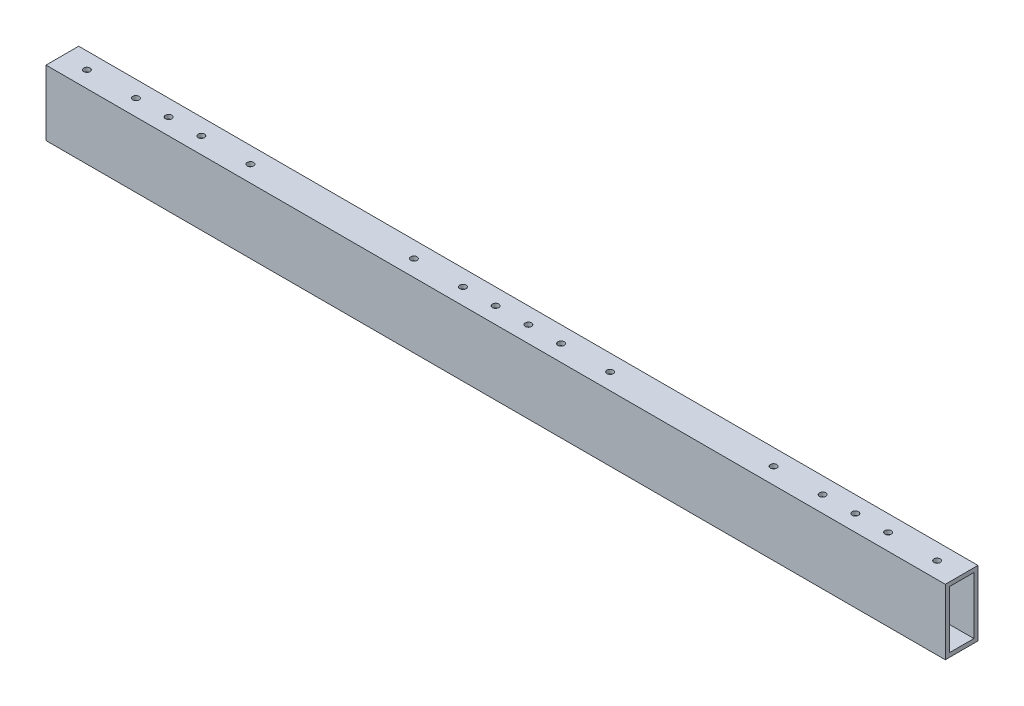
ISO-10303-21;
HEADER;
FILE_DESCRIPTION(('STEP AP214'),'2;1');
FILE_NAME('part.step','',(''),(''),'','','');
FILE_SCHEMA(('AUTOMOTIVE_DESIGN { 1 0 10303 214 1 1 1 1 }'));
ENDSEC;
DATA;
#1=APPLICATION_CONTEXT('core data for automotive mechanical design processes');
#2=APPLICATION_PROTOCOL_DEFINITION('international standard','automotive_design',2000,#1);
#3=PRODUCT_CONTEXT('',#1,'mechanical');
#4=PRODUCT('Part','Part','',(#3));
#5=PRODUCT_RELATED_PRODUCT_CATEGORY('part','',(#4));
#6=PRODUCT_DEFINITION_FORMATION('','',#4);
#7=PRODUCT_DEFINITION_CONTEXT('part definition',#1,'design');
#8=PRODUCT_DEFINITION('design','',#6,#7);
#9=PRODUCT_DEFINITION_SHAPE('','',#8);
#10=(LENGTH_UNIT() NAMED_UNIT(*) SI_UNIT(.MILLI.,.METRE.));
#11=(NAMED_UNIT(*) PLANE_ANGLE_UNIT() SI_UNIT($,.RADIAN.));
#12=(NAMED_UNIT(*) SI_UNIT($,.STERADIAN.) SOLID_ANGLE_UNIT());
#13=UNCERTAINTY_MEASURE_WITH_UNIT(LENGTH_MEASURE(1.E-05),#10,'distance_accuracy_value','');
#14=(GEOMETRIC_REPRESENTATION_CONTEXT(3) GLOBAL_UNCERTAINTY_ASSIGNED_CONTEXT((#13)) GLOBAL_UNIT_ASSIGNED_CONTEXT((#10,
#11,#12)) REPRESENTATION_CONTEXT('',''));
#15=CARTESIAN_POINT('',(0.,0.,0.));
#16=DIRECTION('',(0.,0.,1.));
#17=DIRECTION('',(1.,0.,0.));
#18=AXIS2_PLACEMENT_3D('',#15,#16,#17);
#19=CARTESIAN_POINT('',(-349.25,-3.175,-3.175));
#20=DIRECTION('',(0.,-1.,0.));
#21=DIRECTION('',(0.,0.,-1.));
#22=AXIS2_PLACEMENT_3D('',#19,#20,#21);
#23=PLANE('',#22);
#24=CARTESIAN_POINT('',(190.5,-3.175,9.525));
#25=DIRECTION('',(0.,-1.,0.));
#26=DIRECTION('',(0.,0.,-1.));
#27=AXIS2_PLACEMENT_3D('',#24,#25,#26);
#28=CIRCLE('',#27,2.4638);
#29=CARTESIAN_POINT('',(190.5,-3.175,7.0612));
#30=VERTEX_POINT('',#29);
#31=EDGE_CURVE('E195',#30,#30,#28,.T.);
#32=ORIENTED_EDGE('',*,*,#31,.F.);
#33=EDGE_LOOP('',(#32));
#34=FACE_BOUND('',#33,.T.);
#35=CARTESIAN_POINT('',(114.3,-3.175,9.525));
#36=DIRECTION('',(0.,-1.,0.));
#37=DIRECTION('',(0.,0.,-1.));
#38=AXIS2_PLACEMENT_3D('',#35,#36,#37);
#39=CIRCLE('',#38,2.4638);
#40=CARTESIAN_POINT('',(114.3,-3.175,7.0612));
#41=VERTEX_POINT('',#40);
#42=EDGE_CURVE('E199',#41,#41,#39,.T.);
#43=ORIENTED_EDGE('',*,*,#42,.F.);
#44=EDGE_LOOP('',(#43));
#45=FACE_BOUND('',#44,.T.);
#46=CARTESIAN_POINT('',(38.0999999999999,-3.175,9.525));
#47=DIRECTION('',(0.,-1.,0.));
#48=DIRECTION('',(0.,0.,-1.));
#49=AXIS2_PLACEMENT_3D('',#46,#47,#48);
#50=CIRCLE('',#49,2.4638);
#51=CARTESIAN_POINT('',(38.0999999999999,-3.175,7.0612));
#52=VERTEX_POINT('',#51);
#53=EDGE_CURVE('E203',#52,#52,#50,.T.);
#54=ORIENTED_EDGE('',*,*,#53,.F.);
#55=EDGE_LOOP('',(#54));
#56=FACE_BOUND('',#55,.T.);
#57=CARTESIAN_POINT('',(-38.1,-3.175,9.525));
#58=DIRECTION('',(0.,-1.,0.));
#59=DIRECTION('',(0.,0.,-1.));
#60=AXIS2_PLACEMENT_3D('',#57,#58,#59);
#61=CIRCLE('',#60,2.4638);
#62=CARTESIAN_POINT('',(-38.1,-3.175,7.0612));
#63=VERTEX_POINT('',#62);
#64=EDGE_CURVE('E207',#63,#63,#61,.T.);
#65=ORIENTED_EDGE('',*,*,#64,.F.);
#66=EDGE_LOOP('',(#65));
#67=FACE_BOUND('',#66,.T.);
#68=CARTESIAN_POINT('',(-114.3,-3.175,9.525));
#69=DIRECTION('',(0.,-1.,0.));
#70=DIRECTION('',(0.,0.,-1.));
#71=AXIS2_PLACEMENT_3D('',#68,#69,#70);
#72=CIRCLE('',#71,2.4638);
#73=CARTESIAN_POINT('',(-114.3,-3.175,7.0612));
#74=VERTEX_POINT('',#73);
#75=EDGE_CURVE('E211',#74,#74,#72,.T.);
#76=ORIENTED_EDGE('',*,*,#75,.F.);
#77=EDGE_LOOP('',(#76));
#78=FACE_BOUND('',#77,.T.);
#79=CARTESIAN_POINT('',(-190.5,-3.175,9.525));
#80=DIRECTION('',(0.,-1.,0.));
#81=DIRECTION('',(0.,0.,-1.));
#82=AXIS2_PLACEMENT_3D('',#79,#80,#81);
#83=CIRCLE('',#82,2.4638);
#84=CARTESIAN_POINT('',(-190.5,-3.175,7.0612));
#85=VERTEX_POINT('',#84);
#86=EDGE_CURVE('E215',#85,#85,#83,.T.);
#87=ORIENTED_EDGE('',*,*,#86,.F.);
#88=EDGE_LOOP('',(#87));
#89=FACE_BOUND('',#88,.T.);
#90=CARTESIAN_POINT('',(-266.7,-3.175,9.525));
#91=DIRECTION('',(0.,-1.,0.));
#92=DIRECTION('',(0.,0.,-1.));
#93=AXIS2_PLACEMENT_3D('',#90,#91,#92);
#94=CIRCLE('',#93,2.4638);
#95=CARTESIAN_POINT('',(-266.7,-3.175,7.0612));
#96=VERTEX_POINT('',#95);
#97=EDGE_CURVE('E219',#96,#96,#94,.T.);
#98=ORIENTED_EDGE('',*,*,#97,.F.);
#99=EDGE_LOOP('',(#98));
#100=FACE_BOUND('',#99,.T.);
#101=CARTESIAN_POINT('',(266.7,-3.175,9.525));
#102=DIRECTION('',(0.,-1.,0.));
#103=DIRECTION('',(0.,0.,-1.));
#104=AXIS2_PLACEMENT_3D('',#101,#102,#103);
#105=CIRCLE('',#104,2.4638);
#106=CARTESIAN_POINT('',(266.7,-3.175,7.0612));
#107=VERTEX_POINT('',#106);
#108=EDGE_CURVE('E222',#107,#107,#105,.T.);
#109=ORIENTED_EDGE('',*,*,#108,.F.);
#110=EDGE_LOOP('',(#109));
#111=FACE_BOUND('',#110,.T.);
#112=DIRECTION('',(1.,0.,0.));
#113=VECTOR('',#112,1.);
#114=CARTESIAN_POINT('',(-349.25,-3.175,-3.175));
#115=LINE('',#114,#113);
#116=CARTESIAN_POINT('',(-349.25,-3.175,-3.175));
#117=VERTEX_POINT('',#116);
#118=CARTESIAN_POINT('',(349.25,-3.175,-3.175));
#119=VERTEX_POINT('',#118);
#120=EDGE_CURVE('E35',#117,#119,#115,.T.);
#121=ORIENTED_EDGE('',*,*,#120,.T.);
#122=DIRECTION('',(0.,0.,-1.));
#123=VECTOR('',#122,1.);
#124=CARTESIAN_POINT('',(349.25,-3.175,-3.175));
#125=LINE('',#124,#123);
#126=CARTESIAN_POINT('',(349.25,-3.175,22.225));
#127=VERTEX_POINT('',#126);
#128=EDGE_CURVE('E129',#127,#119,#125,.T.);
#129=ORIENTED_EDGE('',*,*,#128,.F.);
#130=DIRECTION('',(1.,0.,0.));
#131=VECTOR('',#130,1.);
#132=CARTESIAN_POINT('',(-349.25,-3.175,22.225));
#133=LINE('',#132,#131);
#134=CARTESIAN_POINT('',(-349.25,-3.175,22.225));
#135=VERTEX_POINT('',#134);
#136=EDGE_CURVE('E11',#135,#127,#133,.T.);
#137=ORIENTED_EDGE('',*,*,#136,.F.);
#138=DIRECTION('',(0.,0.,-1.));
#139=VECTOR('',#138,1.);
#140=CARTESIAN_POINT('',(-349.25,-3.175,-3.175));
#141=LINE('',#140,#139);
#142=EDGE_CURVE('E148',#135,#117,#141,.T.);
#143=ORIENTED_EDGE('',*,*,#142,.T.);
#144=EDGE_LOOP('',(#121,#129,#137,#143));
#145=FACE_BOUND('',#144,.T.);
#146=ADVANCED_FACE('F32',(#34,#45,#56,#67,#78,#89,#100,#111,#145),#23,.T.);
#147=CARTESIAN_POINT('',(-349.25,-3.175,22.225));
#148=DIRECTION('',(0.,0.,1.));
#149=DIRECTION('',(1.,0.,0.));
#150=AXIS2_PLACEMENT_3D('',#147,#148,#149);
#151=PLANE('',#150);
#152=ORIENTED_EDGE('',*,*,#136,.T.);
#153=DIRECTION('',(0.,-1.,0.));
#154=VECTOR('',#153,1.);
#155=CARTESIAN_POINT('',(349.25,-3.175,22.225));
#156=LINE('',#155,#154);
#157=CARTESIAN_POINT('',(349.25,47.625,22.225));
#158=VERTEX_POINT('',#157);
#159=EDGE_CURVE('E138',#158,#127,#156,.T.);
#160=ORIENTED_EDGE('',*,*,#159,.F.);
#161=DIRECTION('',(1.,0.,0.));
#162=VECTOR('',#161,1.);
#163=CARTESIAN_POINT('',(-349.25,47.625,22.225));
#164=LINE('',#163,#162);
#165=CARTESIAN_POINT('',(-349.25,47.625,22.225));
#166=VERTEX_POINT('',#165);
#167=EDGE_CURVE('E40',#166,#158,#164,.T.);
#168=ORIENTED_EDGE('',*,*,#167,.F.);
#169=DIRECTION('',(0.,-1.,0.));
#170=VECTOR('',#169,1.);
#171=CARTESIAN_POINT('',(-349.25,-3.175,22.225));
#172=LINE('',#171,#170);
#173=EDGE_CURVE('E159',#166,#135,#172,.T.);
#174=ORIENTED_EDGE('',*,*,#173,.T.);
#175=EDGE_LOOP('',(#152,#160,#168,#174));
#176=FACE_BOUND('',#175,.T.);
#177=ADVANCED_FACE('F171',(#176),#151,.T.);
#178=CARTESIAN_POINT('',(-349.25,47.625,-3.175));
#179=DIRECTION('',(0.,1.,0.));
#180=DIRECTION('',(0.,0.,1.));
#181=AXIS2_PLACEMENT_3D('',#178,#179,#180);
#182=PLANE('',#181);
#183=CARTESIAN_POINT('',(292.1,47.625,9.525));
#184=DIRECTION('',(0.,1.,0.));
#185=DIRECTION('',(0.,0.,1.));
#186=AXIS2_PLACEMENT_3D('',#183,#184,#185);
#187=CIRCLE('',#186,2.4638);
#188=CARTESIAN_POINT('',(292.1,47.625,11.9888));
#189=VERTEX_POINT('',#188);
#190=EDGE_CURVE('E239',#189,#189,#187,.T.);
#191=ORIENTED_EDGE('',*,*,#190,.F.);
#192=EDGE_LOOP('',(#191));
#193=FACE_BOUND('',#192,.T.);
#194=CARTESIAN_POINT('',(266.7,47.625,9.525));
#195=DIRECTION('',(0.,1.,0.));
#196=DIRECTION('',(0.,0.,1.));
#197=AXIS2_PLACEMENT_3D('',#194,#195,#196);
#198=CIRCLE('',#197,2.4638);
#199=CARTESIAN_POINT('',(266.7,47.625,11.9888));
#200=VERTEX_POINT('',#199);
#201=EDGE_CURVE('E240',#200,#200,#198,.T.);
#202=ORIENTED_EDGE('',*,*,#201,.F.);
#203=EDGE_LOOP('',(#202));
#204=FACE_BOUND('',#203,.T.);
#205=CARTESIAN_POINT('',(241.3,47.625,9.525));
#206=DIRECTION('',(0.,1.,0.));
#207=DIRECTION('',(0.,0.,1.));
#208=AXIS2_PLACEMENT_3D('',#205,#206,#207);
#209=CIRCLE('',#208,2.4638);
#210=CARTESIAN_POINT('',(241.3,47.625,11.9888));
#211=VERTEX_POINT('',#210);
#212=EDGE_CURVE('E247',#211,#211,#209,.T.);
#213=ORIENTED_EDGE('',*,*,#212,.F.);
#214=EDGE_LOOP('',(#213));
#215=FACE_BOUND('',#214,.T.);
#216=CARTESIAN_POINT('',(203.2,47.625,9.525));
#217=DIRECTION('',(0.,1.,0.));
#218=DIRECTION('',(0.,0.,1.));
#219=AXIS2_PLACEMENT_3D('',#216,#217,#218);
#220=CIRCLE('',#219,2.4638);
#221=CARTESIAN_POINT('',(203.2,47.625,11.9888));
#222=VERTEX_POINT('',#221);
#223=EDGE_CURVE('E253',#222,#222,#220,.T.);
#224=ORIENTED_EDGE('',*,*,#223,.F.);
#225=EDGE_LOOP('',(#224));
#226=FACE_BOUND('',#225,.T.);
#227=CARTESIAN_POINT('',(76.2000000000001,47.625,9.52500000000001));
#228=DIRECTION('',(0.,1.,0.));
#229=DIRECTION('',(0.,0.,1.));
#230=AXIS2_PLACEMENT_3D('',#227,#228,#229);
#231=CIRCLE('',#230,2.4638);
#232=CARTESIAN_POINT('',(76.2000000000001,47.625,11.9888));
#233=VERTEX_POINT('',#232);
#234=EDGE_CURVE('E259',#233,#233,#231,.T.);
#235=ORIENTED_EDGE('',*,*,#234,.F.);
#236=EDGE_LOOP('',(#235));
#237=FACE_BOUND('',#236,.T.);
#238=CARTESIAN_POINT('',(38.1000000000001,47.625,9.52500000000001));
#239=DIRECTION('',(0.,1.,0.));
#240=DIRECTION('',(0.,0.,1.));
#241=AXIS2_PLACEMENT_3D('',#238,#239,#240);
#242=CIRCLE('',#241,2.46380000000001);
#243=CARTESIAN_POINT('',(38.1000000000001,47.625,11.9888));
#244=VERTEX_POINT('',#243);
#245=EDGE_CURVE('E265',#244,#244,#242,.T.);
#246=ORIENTED_EDGE('',*,*,#245,.F.);
#247=EDGE_LOOP('',(#246));
#248=FACE_BOUND('',#247,.T.);
#249=CARTESIAN_POINT('',(12.7000000000001,47.625,9.52500000000001));
#250=DIRECTION('',(0.,1.,0.));
#251=DIRECTION('',(0.,0.,1.));
#252=AXIS2_PLACEMENT_3D('',#249,#250,#251);
#253=CIRCLE('',#252,2.4638);
#254=CARTESIAN_POINT('',(12.7000000000001,47.625,11.9888));
#255=VERTEX_POINT('',#254);
#256=EDGE_CURVE('E271',#255,#255,#253,.T.);
#257=ORIENTED_EDGE('',*,*,#256,.F.);
#258=EDGE_LOOP('',(#257));
#259=FACE_BOUND('',#258,.T.);
#260=CARTESIAN_POINT('',(-12.6999999999999,47.625,9.52500000000001));
#261=DIRECTION('',(0.,1.,0.));
#262=DIRECTION('',(0.,0.,1.));
#263=AXIS2_PLACEMENT_3D('',#260,#261,#262);
#264=CIRCLE('',#263,2.4638);
#265=CARTESIAN_POINT('',(-12.6999999999999,47.625,11.9888));
#266=VERTEX_POINT('',#265);
#267=EDGE_CURVE('E277',#266,#266,#264,.T.);
#268=ORIENTED_EDGE('',*,*,#267,.F.);
#269=EDGE_LOOP('',(#268));
#270=FACE_BOUND('',#269,.T.);
#271=CARTESIAN_POINT('',(-38.0999999999999,47.625,9.525));
#272=DIRECTION('',(0.,1.,0.));
#273=DIRECTION('',(0.,0.,1.));
#274=AXIS2_PLACEMENT_3D('',#271,#272,#273);
#275=CIRCLE('',#274,2.46380000000001);
#276=CARTESIAN_POINT('',(-38.0999999999999,47.625,11.9888));
#277=VERTEX_POINT('',#276);
#278=EDGE_CURVE('E283',#277,#277,#275,.T.);
#279=ORIENTED_EDGE('',*,*,#278,.F.);
#280=EDGE_LOOP('',(#279));
#281=FACE_BOUND('',#280,.T.);
#282=CARTESIAN_POINT('',(-76.1999999999999,47.625,9.525));
#283=DIRECTION('',(0.,1.,0.));
#284=DIRECTION('',(0.,0.,1.));
#285=AXIS2_PLACEMENT_3D('',#282,#283,#284);
#286=CIRCLE('',#285,2.4638);
#287=CARTESIAN_POINT('',(-76.1999999999999,47.625,11.9888));
#288=VERTEX_POINT('',#287);
#289=EDGE_CURVE('E289',#288,#288,#286,.T.);
#290=ORIENTED_EDGE('',*,*,#289,.F.);
#291=EDGE_LOOP('',(#290));
#292=FACE_BOUND('',#291,.T.);
#293=CARTESIAN_POINT('',(-203.2,47.625,9.52499999999999));
#294=DIRECTION('',(0.,1.,0.));
#295=DIRECTION('',(0.,0.,1.));
#296=AXIS2_PLACEMENT_3D('',#293,#294,#295);
#297=CIRCLE('',#296,2.4638);
#298=CARTESIAN_POINT('',(-203.2,47.625,11.9888));
#299=VERTEX_POINT('',#298);
#300=EDGE_CURVE('E295',#299,#299,#297,.T.);
#301=ORIENTED_EDGE('',*,*,#300,.F.);
#302=EDGE_LOOP('',(#301));
#303=FACE_BOUND('',#302,.T.);
#304=CARTESIAN_POINT('',(-266.7,47.625,9.525));
#305=DIRECTION('',(0.,1.,0.));
#306=DIRECTION('',(0.,0.,1.));
#307=AXIS2_PLACEMENT_3D('',#304,#305,#306);
#308=CIRCLE('',#307,2.4638);
#309=CARTESIAN_POINT('',(-266.7,47.625,11.9888));
#310=VERTEX_POINT('',#309);
#311=EDGE_CURVE('E308',#310,#310,#308,.T.);
#312=ORIENTED_EDGE('',*,*,#311,.F.);
#313=EDGE_LOOP('',(#312));
#314=FACE_BOUND('',#313,.T.);
#315=CARTESIAN_POINT('',(-292.1,47.625,9.525));
#316=DIRECTION('',(0.,1.,0.));
#317=DIRECTION('',(0.,0.,1.));
#318=AXIS2_PLACEMENT_3D('',#315,#316,#317);
#319=CIRCLE('',#318,2.4638);
#320=CARTESIAN_POINT('',(-292.1,47.625,11.9888));
#321=VERTEX_POINT('',#320);
#322=EDGE_CURVE('E307',#321,#321,#319,.T.);
#323=ORIENTED_EDGE('',*,*,#322,.F.);
#324=EDGE_LOOP('',(#323));
#325=FACE_BOUND('',#324,.T.);
#326=CARTESIAN_POINT('',(-330.2,47.625,9.52500000000001));
#327=DIRECTION('',(0.,1.,0.));
#328=DIRECTION('',(0.,0.,1.));
#329=AXIS2_PLACEMENT_3D('',#326,#327,#328);
#330=CIRCLE('',#329,2.4638);
#331=CARTESIAN_POINT('',(-330.2,47.625,11.9888));
#332=VERTEX_POINT('',#331);
#333=EDGE_CURVE('E319',#332,#332,#330,.T.);
#334=ORIENTED_EDGE('',*,*,#333,.F.);
#335=EDGE_LOOP('',(#334));
#336=FACE_BOUND('',#335,.T.);
#337=CARTESIAN_POINT('',(-241.3,47.625,9.525));
#338=DIRECTION('',(0.,1.,0.));
#339=DIRECTION('',(0.,0.,1.));
#340=AXIS2_PLACEMENT_3D('',#337,#338,#339);
#341=CIRCLE('',#340,2.4638);
#342=CARTESIAN_POINT('',(-241.3,47.625,11.9888));
#343=VERTEX_POINT('',#342);
#344=EDGE_CURVE('E301',#343,#343,#341,.T.);
#345=ORIENTED_EDGE('',*,*,#344,.F.);
#346=EDGE_LOOP('',(#345));
#347=FACE_BOUND('',#346,.T.);
#348=CARTESIAN_POINT('',(330.2,47.625,9.525));
#349=DIRECTION('',(0.,1.,0.));
#350=DIRECTION('',(0.,0.,1.));
#351=AXIS2_PLACEMENT_3D('',#348,#349,#350);
#352=CIRCLE('',#351,2.4638);
#353=CARTESIAN_POINT('',(330.2,47.625,11.9888));
#354=VERTEX_POINT('',#353);
#355=EDGE_CURVE('E118',#354,#354,#352,.T.);
#356=ORIENTED_EDGE('',*,*,#355,.F.);
#357=EDGE_LOOP('',(#356));
#358=FACE_BOUND('',#357,.T.);
#359=ORIENTED_EDGE('',*,*,#167,.T.);
#360=DIRECTION('',(0.,0.,1.));
#361=VECTOR('',#360,1.);
#362=CARTESIAN_POINT('',(349.25,47.625,-3.175));
#363=LINE('',#362,#361);
#364=CARTESIAN_POINT('',(349.25,47.625,-3.175));
#365=VERTEX_POINT('',#364);
#366=EDGE_CURVE('E135',#365,#158,#363,.T.);
#367=ORIENTED_EDGE('',*,*,#366,.F.);
#368=DIRECTION('',(1.,0.,0.));
#369=VECTOR('',#368,1.);
#370=CARTESIAN_POINT('',(-349.25,47.625,-3.175));
#371=LINE('',#370,#369);
#372=CARTESIAN_POINT('',(-349.25,47.625,-3.175));
#373=VERTEX_POINT('',#372);
#374=EDGE_CURVE('E162',#373,#365,#371,.T.);
#375=ORIENTED_EDGE('',*,*,#374,.F.);
#376=DIRECTION('',(0.,0.,1.));
#377=VECTOR('',#376,1.);
#378=CARTESIAN_POINT('',(-349.25,47.625,-3.175));
#379=LINE('',#378,#377);
#380=EDGE_CURVE('E156',#373,#166,#379,.T.);
#381=ORIENTED_EDGE('',*,*,#380,.T.);
#382=EDGE_LOOP('',(#359,#367,#375,#381));
#383=FACE_BOUND('',#382,.T.);
#384=ADVANCED_FACE('F177',(#193,#204,#215,#226,#237,#248,#259,#270,#281,#292,#303,#314,#325,
#336,#347,#358,#383),#182,.T.);
#385=CARTESIAN_POINT('',(-349.25,-3.175,-3.175));
#386=DIRECTION('',(0.,0.,-1.));
#387=DIRECTION('',(-1.,0.,0.));
#388=AXIS2_PLACEMENT_3D('',#385,#386,#387);
#389=PLANE('',#388);
#390=ORIENTED_EDGE('',*,*,#374,.T.);
#391=DIRECTION('',(0.,1.,0.));
#392=VECTOR('',#391,1.);
#393=CARTESIAN_POINT('',(349.25,-3.175,-3.175));
#394=LINE('',#393,#392);
#395=EDGE_CURVE('E132',#119,#365,#394,.T.);
#396=ORIENTED_EDGE('',*,*,#395,.F.);
#397=ORIENTED_EDGE('',*,*,#120,.F.);
#398=DIRECTION('',(0.,1.,0.));
#399=VECTOR('',#398,1.);
#400=CARTESIAN_POINT('',(-349.25,-3.175,-3.175));
#401=LINE('',#400,#399);
#402=EDGE_CURVE('E153',#117,#373,#401,.T.);
#403=ORIENTED_EDGE('',*,*,#402,.T.);
#404=EDGE_LOOP('',(#390,#396,#397,#403));
#405=FACE_BOUND('',#404,.T.);
#406=ADVANCED_FACE('F166',(#405),#389,.T.);
#407=CARTESIAN_POINT('',(-349.25,0.,0.));
#408=DIRECTION('',(-1.,0.,0.));
#409=DIRECTION('',(0.,0.,1.));
#410=AXIS2_PLACEMENT_3D('',#407,#408,#409);
#411=PLANE('',#410);
#412=DIRECTION('',(0.,1.,0.));
#413=VECTOR('',#412,1.);
#414=CARTESIAN_POINT('',(-349.25,0.,0.));
#415=LINE('',#414,#413);
#416=CARTESIAN_POINT('',(-349.25,0.,0.));
#417=VERTEX_POINT('',#416);
#418=CARTESIAN_POINT('',(-349.25,44.45,0.));
#419=VERTEX_POINT('',#418);
#420=EDGE_CURVE('E141',#417,#419,#415,.T.);
#421=ORIENTED_EDGE('',*,*,#420,.T.);
#422=DIRECTION('',(0.,0.,1.));
#423=VECTOR('',#422,1.);
#424=CARTESIAN_POINT('',(-349.25,44.45,0.));
#425=LINE('',#424,#423);
#426=CARTESIAN_POINT('',(-349.25,44.45,19.05));
#427=VERTEX_POINT('',#426);
#428=EDGE_CURVE('E104',#419,#427,#425,.T.);
#429=ORIENTED_EDGE('',*,*,#428,.T.);
#430=DIRECTION('',(0.,-1.,0.));
#431=VECTOR('',#430,1.);
#432=CARTESIAN_POINT('',(-349.25,0.,19.05));
#433=LINE('',#432,#431);
#434=CARTESIAN_POINT('',(-349.25,0.,19.05));
#435=VERTEX_POINT('',#434);
#436=EDGE_CURVE('E48',#427,#435,#433,.T.);
#437=ORIENTED_EDGE('',*,*,#436,.T.);
#438=DIRECTION('',(0.,0.,-1.));
#439=VECTOR('',#438,1.);
#440=CARTESIAN_POINT('',(-349.25,0.,0.));
#441=LINE('',#440,#439);
#442=EDGE_CURVE('E109',#435,#417,#441,.T.);
#443=ORIENTED_EDGE('',*,*,#442,.T.);
#444=EDGE_LOOP('',(#421,#429,#437,#443));
#445=FACE_BOUND('',#444,.T.);
#446=ORIENTED_EDGE('',*,*,#142,.F.);
#447=ORIENTED_EDGE('',*,*,#173,.F.);
#448=ORIENTED_EDGE('',*,*,#380,.F.);
#449=ORIENTED_EDGE('',*,*,#402,.F.);
#450=EDGE_LOOP('',(#446,#447,#448,#449));
#451=FACE_BOUND('',#450,.T.);
#452=ADVANCED_FACE('F175',(#445,#451),#411,.T.);
#453=CARTESIAN_POINT('',(-349.25,0.,0.));
#454=DIRECTION('',(0.,0.,-1.));
#455=DIRECTION('',(-1.,0.,0.));
#456=AXIS2_PLACEMENT_3D('',#453,#454,#455);
#457=PLANE('',#456);
#458=DIRECTION('',(1.,0.,0.));
#459=VECTOR('',#458,1.);
#460=CARTESIAN_POINT('',(-349.25,0.,0.));
#461=LINE('',#460,#459);
#462=CARTESIAN_POINT('',(349.25,0.,0.));
#463=VERTEX_POINT('',#462);
#464=EDGE_CURVE('E114',#417,#463,#461,.T.);
#465=ORIENTED_EDGE('',*,*,#464,.T.);
#466=DIRECTION('',(0.,1.,0.));
#467=VECTOR('',#466,1.);
#468=CARTESIAN_POINT('',(349.25,0.,0.));
#469=LINE('',#468,#467);
#470=CARTESIAN_POINT('',(349.25,44.45,0.));
#471=VERTEX_POINT('',#470);
#472=EDGE_CURVE('E112',#463,#471,#469,.T.);
#473=ORIENTED_EDGE('',*,*,#472,.T.);
#474=DIRECTION('',(1.,0.,0.));
#475=VECTOR('',#474,1.);
#476=CARTESIAN_POINT('',(-349.25,44.45,0.));
#477=LINE('',#476,#475);
#478=EDGE_CURVE('E97',#419,#471,#477,.T.);
#479=ORIENTED_EDGE('',*,*,#478,.F.);
#480=ORIENTED_EDGE('',*,*,#420,.F.);
#481=EDGE_LOOP('',(#465,#473,#479,#480));
#482=FACE_BOUND('',#481,.T.);
#483=ADVANCED_FACE('F113',(#482),#457,.F.);
#484=CARTESIAN_POINT('',(-349.25,0.,0.));
#485=DIRECTION('',(0.,-1.,0.));
#486=DIRECTION('',(0.,0.,-1.));
#487=AXIS2_PLACEMENT_3D('',#484,#485,#486);
#488=PLANE('',#487);
#489=CARTESIAN_POINT('',(190.5,0.,9.525));
#490=DIRECTION('',(0.,-1.,0.));
#491=DIRECTION('',(0.,0.,-1.));
#492=AXIS2_PLACEMENT_3D('',#489,#490,#491);
#493=CIRCLE('',#492,2.4638);
#494=CARTESIAN_POINT('',(190.5,0.,7.0612));
#495=VERTEX_POINT('',#494);
#496=EDGE_CURVE('E225',#495,#495,#493,.F.);
#497=ORIENTED_EDGE('',*,*,#496,.F.);
#498=EDGE_LOOP('',(#497));
#499=FACE_BOUND('',#498,.T.);
#500=CARTESIAN_POINT('',(114.3,0.,9.525));
#501=DIRECTION('',(0.,-1.,0.));
#502=DIRECTION('',(0.,0.,-1.));
#503=AXIS2_PLACEMENT_3D('',#500,#501,#502);
#504=CIRCLE('',#503,2.4638);
#505=CARTESIAN_POINT('',(114.3,0.,7.0612));
#506=VERTEX_POINT('',#505);
#507=EDGE_CURVE('E460',#506,#506,#504,.F.);
#508=ORIENTED_EDGE('',*,*,#507,.F.);
#509=EDGE_LOOP('',(#508));
#510=FACE_BOUND('',#509,.T.);
#511=CARTESIAN_POINT('',(38.0999999999999,0.,9.525));
#512=DIRECTION('',(0.,-1.,0.));
#513=DIRECTION('',(0.,0.,-1.));
#514=AXIS2_PLACEMENT_3D('',#511,#512,#513);
#515=CIRCLE('',#514,2.4638);
#516=CARTESIAN_POINT('',(38.0999999999999,0.,7.0612));
#517=VERTEX_POINT('',#516);
#518=EDGE_CURVE('E465',#517,#517,#515,.F.);
#519=ORIENTED_EDGE('',*,*,#518,.F.);
#520=EDGE_LOOP('',(#519));
#521=FACE_BOUND('',#520,.T.);
#522=CARTESIAN_POINT('',(-38.1,0.,9.525));
#523=DIRECTION('',(0.,-1.,0.));
#524=DIRECTION('',(0.,0.,-1.));
#525=AXIS2_PLACEMENT_3D('',#522,#523,#524);
#526=CIRCLE('',#525,2.4638);
#527=CARTESIAN_POINT('',(-38.1,0.,7.0612));
#528=VERTEX_POINT('',#527);
#529=EDGE_CURVE('E468',#528,#528,#526,.F.);
#530=ORIENTED_EDGE('',*,*,#529,.F.);
#531=EDGE_LOOP('',(#530));
#532=FACE_BOUND('',#531,.T.);
#533=CARTESIAN_POINT('',(-114.3,0.,9.525));
#534=DIRECTION('',(0.,-1.,0.));
#535=DIRECTION('',(0.,0.,-1.));
#536=AXIS2_PLACEMENT_3D('',#533,#534,#535);
#537=CIRCLE('',#536,2.4638);
#538=CARTESIAN_POINT('',(-114.3,0.,7.0612));
#539=VERTEX_POINT('',#538);
#540=EDGE_CURVE('E472',#539,#539,#537,.F.);
#541=ORIENTED_EDGE('',*,*,#540,.F.);
#542=EDGE_LOOP('',(#541));
#543=FACE_BOUND('',#542,.T.);
#544=CARTESIAN_POINT('',(-190.5,0.,9.525));
#545=DIRECTION('',(0.,-1.,0.));
#546=DIRECTION('',(0.,0.,-1.));
#547=AXIS2_PLACEMENT_3D('',#544,#545,#546);
#548=CIRCLE('',#547,2.4638);
#549=CARTESIAN_POINT('',(-190.5,0.,7.0612));
#550=VERTEX_POINT('',#549);
#551=EDGE_CURVE('E476',#550,#550,#548,.F.);
#552=ORIENTED_EDGE('',*,*,#551,.F.);
#553=EDGE_LOOP('',(#552));
#554=FACE_BOUND('',#553,.T.);
#555=CARTESIAN_POINT('',(-266.7,0.,9.525));
#556=DIRECTION('',(0.,-1.,0.));
#557=DIRECTION('',(0.,0.,-1.));
#558=AXIS2_PLACEMENT_3D('',#555,#556,#557);
#559=CIRCLE('',#558,2.4638);
#560=CARTESIAN_POINT('',(-266.7,0.,7.0612));
#561=VERTEX_POINT('',#560);
#562=EDGE_CURVE('E233',#561,#561,#559,.F.);
#563=ORIENTED_EDGE('',*,*,#562,.F.);
#564=EDGE_LOOP('',(#563));
#565=FACE_BOUND('',#564,.T.);
#566=CARTESIAN_POINT('',(266.7,0.,9.525));
#567=DIRECTION('',(0.,-1.,0.));
#568=DIRECTION('',(0.,0.,-1.));
#569=AXIS2_PLACEMENT_3D('',#566,#567,#568);
#570=CIRCLE('',#569,2.4638);
#571=CARTESIAN_POINT('',(266.7,0.,7.0612));
#572=VERTEX_POINT('',#571);
#573=EDGE_CURVE('E224',#572,#572,#570,.F.);
#574=ORIENTED_EDGE('',*,*,#573,.F.);
#575=EDGE_LOOP('',(#574));
#576=FACE_BOUND('',#575,.T.);
#577=DIRECTION('',(1.,0.,0.));
#578=VECTOR('',#577,1.);
#579=CARTESIAN_POINT('',(-349.25,0.,19.05));
#580=LINE('',#579,#578);
#581=CARTESIAN_POINT('',(349.25,0.,19.05));
#582=VERTEX_POINT('',#581);
#583=EDGE_CURVE('E149',#435,#582,#580,.T.);
#584=ORIENTED_EDGE('',*,*,#583,.T.);
#585=DIRECTION('',(0.,0.,-1.));
#586=VECTOR('',#585,1.);
#587=CARTESIAN_POINT('',(349.25,0.,0.));
#588=LINE('',#587,#586);
#589=EDGE_CURVE('E124',#582,#463,#588,.T.);
#590=ORIENTED_EDGE('',*,*,#589,.T.);
#591=ORIENTED_EDGE('',*,*,#464,.F.);
#592=ORIENTED_EDGE('',*,*,#442,.F.);
#593=EDGE_LOOP('',(#584,#590,#591,#592));
#594=FACE_BOUND('',#593,.T.);
#595=ADVANCED_FACE('F347',(#499,#510,#521,#532,#543,#554,#565,#576,#594),#488,.F.);
#596=CARTESIAN_POINT('',(-349.25,0.,19.05));
#597=DIRECTION('',(0.,0.,1.));
#598=DIRECTION('',(1.,0.,0.));
#599=AXIS2_PLACEMENT_3D('',#596,#597,#598);
#600=PLANE('',#599);
#601=DIRECTION('',(1.,0.,0.));
#602=VECTOR('',#601,1.);
#603=CARTESIAN_POINT('',(-349.25,44.45,19.05));
#604=LINE('',#603,#602);
#605=CARTESIAN_POINT('',(349.25,44.45,19.05));
#606=VERTEX_POINT('',#605);
#607=EDGE_CURVE('E108',#427,#606,#604,.T.);
#608=ORIENTED_EDGE('',*,*,#607,.T.);
#609=DIRECTION('',(0.,-1.,0.));
#610=VECTOR('',#609,1.);
#611=CARTESIAN_POINT('',(349.25,0.,19.05));
#612=LINE('',#611,#610);
#613=EDGE_CURVE('E122',#606,#582,#612,.T.);
#614=ORIENTED_EDGE('',*,*,#613,.T.);
#615=ORIENTED_EDGE('',*,*,#583,.F.);
#616=ORIENTED_EDGE('',*,*,#436,.F.);
#617=EDGE_LOOP('',(#608,#614,#615,#616));
#618=FACE_BOUND('',#617,.T.);
#619=ADVANCED_FACE('F339',(#618),#600,.F.);
#620=CARTESIAN_POINT('',(-349.25,44.45,0.));
#621=DIRECTION('',(0.,1.,0.));
#622=DIRECTION('',(0.,0.,1.));
#623=AXIS2_PLACEMENT_3D('',#620,#621,#622);
#624=PLANE('',#623);
#625=CARTESIAN_POINT('',(292.1,44.45,9.525));
#626=DIRECTION('',(0.,1.,0.));
#627=DIRECTION('',(0.,0.,1.));
#628=AXIS2_PLACEMENT_3D('',#625,#626,#627);
#629=CIRCLE('',#628,2.4638);
#630=CARTESIAN_POINT('',(292.1,44.45,11.9888));
#631=VERTEX_POINT('',#630);
#632=EDGE_CURVE('E236',#631,#631,#629,.F.);
#633=ORIENTED_EDGE('',*,*,#632,.F.);
#634=EDGE_LOOP('',(#633));
#635=FACE_BOUND('',#634,.T.);
#636=CARTESIAN_POINT('',(266.7,44.45,9.525));
#637=DIRECTION('',(0.,1.,0.));
#638=DIRECTION('',(0.,0.,1.));
#639=AXIS2_PLACEMENT_3D('',#636,#637,#638);
#640=CIRCLE('',#639,2.4638);
#641=CARTESIAN_POINT('',(266.7,44.45,11.9888));
#642=VERTEX_POINT('',#641);
#643=EDGE_CURVE('E244',#642,#642,#640,.F.);
#644=ORIENTED_EDGE('',*,*,#643,.F.);
#645=EDGE_LOOP('',(#644));
#646=FACE_BOUND('',#645,.T.);
#647=CARTESIAN_POINT('',(241.3,44.45,9.525));
#648=DIRECTION('',(0.,1.,0.));
#649=DIRECTION('',(0.,0.,1.));
#650=AXIS2_PLACEMENT_3D('',#647,#648,#649);
#651=CIRCLE('',#650,2.4638);
#652=CARTESIAN_POINT('',(241.3,44.45,11.9888));
#653=VERTEX_POINT('',#652);
#654=EDGE_CURVE('E250',#653,#653,#651,.F.);
#655=ORIENTED_EDGE('',*,*,#654,.F.);
#656=EDGE_LOOP('',(#655));
#657=FACE_BOUND('',#656,.T.);
#658=CARTESIAN_POINT('',(203.2,44.45,9.525));
#659=DIRECTION('',(0.,1.,0.));
#660=DIRECTION('',(0.,0.,1.));
#661=AXIS2_PLACEMENT_3D('',#658,#659,#660);
#662=CIRCLE('',#661,2.4638);
#663=CARTESIAN_POINT('',(203.2,44.45,11.9888));
#664=VERTEX_POINT('',#663);
#665=EDGE_CURVE('E256',#664,#664,#662,.F.);
#666=ORIENTED_EDGE('',*,*,#665,.F.);
#667=EDGE_LOOP('',(#666));
#668=FACE_BOUND('',#667,.T.);
#669=CARTESIAN_POINT('',(76.2000000000001,44.45,9.52500000000001));
#670=DIRECTION('',(0.,1.,0.));
#671=DIRECTION('',(0.,0.,1.));
#672=AXIS2_PLACEMENT_3D('',#669,#670,#671);
#673=CIRCLE('',#672,2.4638);
#674=CARTESIAN_POINT('',(76.2000000000001,44.45,11.9888));
#675=VERTEX_POINT('',#674);
#676=EDGE_CURVE('E262',#675,#675,#673,.F.);
#677=ORIENTED_EDGE('',*,*,#676,.F.);
#678=EDGE_LOOP('',(#677));
#679=FACE_BOUND('',#678,.T.);
#680=CARTESIAN_POINT('',(38.1000000000001,44.45,9.52500000000001));
#681=DIRECTION('',(0.,1.,0.));
#682=DIRECTION('',(0.,0.,1.));
#683=AXIS2_PLACEMENT_3D('',#680,#681,#682);
#684=CIRCLE('',#683,2.46380000000001);
#685=CARTESIAN_POINT('',(38.1000000000001,44.45,11.9888));
#686=VERTEX_POINT('',#685);
#687=EDGE_CURVE('E268',#686,#686,#684,.F.);
#688=ORIENTED_EDGE('',*,*,#687,.F.);
#689=EDGE_LOOP('',(#688));
#690=FACE_BOUND('',#689,.T.);
#691=CARTESIAN_POINT('',(12.7000000000001,44.45,9.52500000000001));
#692=DIRECTION('',(0.,1.,0.));
#693=DIRECTION('',(0.,0.,1.));
#694=AXIS2_PLACEMENT_3D('',#691,#692,#693);
#695=CIRCLE('',#694,2.4638);
#696=CARTESIAN_POINT('',(12.7000000000001,44.45,11.9888));
#697=VERTEX_POINT('',#696);
#698=EDGE_CURVE('E274',#697,#697,#695,.F.);
#699=ORIENTED_EDGE('',*,*,#698,.F.);
#700=EDGE_LOOP('',(#699));
#701=FACE_BOUND('',#700,.T.);
#702=CARTESIAN_POINT('',(-12.6999999999999,44.45,9.52500000000001));
#703=DIRECTION('',(0.,1.,0.));
#704=DIRECTION('',(0.,0.,1.));
#705=AXIS2_PLACEMENT_3D('',#702,#703,#704);
#706=CIRCLE('',#705,2.4638);
#707=CARTESIAN_POINT('',(-12.6999999999999,44.45,11.9888));
#708=VERTEX_POINT('',#707);
#709=EDGE_CURVE('E280',#708,#708,#706,.F.);
#710=ORIENTED_EDGE('',*,*,#709,.F.);
#711=EDGE_LOOP('',(#710));
#712=FACE_BOUND('',#711,.T.);
#713=CARTESIAN_POINT('',(-38.0999999999999,44.45,9.525));
#714=DIRECTION('',(0.,1.,0.));
#715=DIRECTION('',(0.,0.,1.));
#716=AXIS2_PLACEMENT_3D('',#713,#714,#715);
#717=CIRCLE('',#716,2.46380000000001);
#718=CARTESIAN_POINT('',(-38.0999999999999,44.45,11.9888));
#719=VERTEX_POINT('',#718);
#720=EDGE_CURVE('E286',#719,#719,#717,.F.);
#721=ORIENTED_EDGE('',*,*,#720,.F.);
#722=EDGE_LOOP('',(#721));
#723=FACE_BOUND('',#722,.T.);
#724=CARTESIAN_POINT('',(-76.1999999999999,44.45,9.525));
#725=DIRECTION('',(0.,1.,0.));
#726=DIRECTION('',(0.,0.,1.));
#727=AXIS2_PLACEMENT_3D('',#724,#725,#726);
#728=CIRCLE('',#727,2.4638);
#729=CARTESIAN_POINT('',(-76.1999999999999,44.45,11.9888));
#730=VERTEX_POINT('',#729);
#731=EDGE_CURVE('E292',#730,#730,#728,.F.);
#732=ORIENTED_EDGE('',*,*,#731,.F.);
#733=EDGE_LOOP('',(#732));
#734=FACE_BOUND('',#733,.T.);
#735=CARTESIAN_POINT('',(-203.2,44.45,9.52499999999999));
#736=DIRECTION('',(0.,1.,0.));
#737=DIRECTION('',(0.,0.,1.));
#738=AXIS2_PLACEMENT_3D('',#735,#736,#737);
#739=CIRCLE('',#738,2.4638);
#740=CARTESIAN_POINT('',(-203.2,44.45,11.9888));
#741=VERTEX_POINT('',#740);
#742=EDGE_CURVE('E298',#741,#741,#739,.F.);
#743=ORIENTED_EDGE('',*,*,#742,.F.);
#744=EDGE_LOOP('',(#743));
#745=FACE_BOUND('',#744,.T.);
#746=CARTESIAN_POINT('',(-266.7,44.45,9.525));
#747=DIRECTION('',(0.,1.,0.));
#748=DIRECTION('',(0.,0.,1.));
#749=AXIS2_PLACEMENT_3D('',#746,#747,#748);
#750=CIRCLE('',#749,2.4638);
#751=CARTESIAN_POINT('',(-266.7,44.45,11.9888));
#752=VERTEX_POINT('',#751);
#753=EDGE_CURVE('E228',#752,#752,#750,.F.);
#754=ORIENTED_EDGE('',*,*,#753,.F.);
#755=EDGE_LOOP('',(#754));
#756=FACE_BOUND('',#755,.T.);
#757=CARTESIAN_POINT('',(-292.1,44.45,9.525));
#758=DIRECTION('',(0.,1.,0.));
#759=DIRECTION('',(0.,0.,1.));
#760=AXIS2_PLACEMENT_3D('',#757,#758,#759);
#761=CIRCLE('',#760,2.4638);
#762=CARTESIAN_POINT('',(-292.1,44.45,11.9888));
#763=VERTEX_POINT('',#762);
#764=EDGE_CURVE('E304',#763,#763,#761,.F.);
#765=ORIENTED_EDGE('',*,*,#764,.F.);
#766=EDGE_LOOP('',(#765));
#767=FACE_BOUND('',#766,.T.);
#768=CARTESIAN_POINT('',(-330.2,44.45,9.52500000000001));
#769=DIRECTION('',(0.,1.,0.));
#770=DIRECTION('',(0.,0.,1.));
#771=AXIS2_PLACEMENT_3D('',#768,#769,#770);
#772=CIRCLE('',#771,2.4638);
#773=CARTESIAN_POINT('',(-330.2,44.45,11.9888));
#774=VERTEX_POINT('',#773);
#775=EDGE_CURVE('E311',#774,#774,#772,.F.);
#776=ORIENTED_EDGE('',*,*,#775,.F.);
#777=EDGE_LOOP('',(#776));
#778=FACE_BOUND('',#777,.T.);
#779=CARTESIAN_POINT('',(-241.3,44.45,9.525));
#780=DIRECTION('',(0.,1.,0.));
#781=DIRECTION('',(0.,0.,1.));
#782=AXIS2_PLACEMENT_3D('',#779,#780,#781);
#783=CIRCLE('',#782,2.4638);
#784=CARTESIAN_POINT('',(-241.3,44.45,11.9888));
#785=VERTEX_POINT('',#784);
#786=EDGE_CURVE('E316',#785,#785,#783,.F.);
#787=ORIENTED_EDGE('',*,*,#786,.F.);
#788=EDGE_LOOP('',(#787));
#789=FACE_BOUND('',#788,.T.);
#790=CARTESIAN_POINT('',(330.2,44.45,9.525));
#791=DIRECTION('',(0.,1.,0.));
#792=DIRECTION('',(0.,0.,1.));
#793=AXIS2_PLACEMENT_3D('',#790,#791,#792);
#794=CIRCLE('',#793,2.4638);
#795=CARTESIAN_POINT('',(330.2,44.45,11.9888));
#796=VERTEX_POINT('',#795);
#797=EDGE_CURVE('E243',#796,#796,#794,.F.);
#798=ORIENTED_EDGE('',*,*,#797,.F.);
#799=EDGE_LOOP('',(#798));
#800=FACE_BOUND('',#799,.T.);
#801=ORIENTED_EDGE('',*,*,#478,.T.);
#802=DIRECTION('',(0.,0.,1.));
#803=VECTOR('',#802,1.);
#804=CARTESIAN_POINT('',(349.25,44.45,0.));
#805=LINE('',#804,#803);
#806=EDGE_CURVE('E101',#471,#606,#805,.T.);
#807=ORIENTED_EDGE('',*,*,#806,.T.);
#808=ORIENTED_EDGE('',*,*,#607,.F.);
#809=ORIENTED_EDGE('',*,*,#428,.F.);
#810=EDGE_LOOP('',(#801,#807,#808,#809));
#811=FACE_BOUND('',#810,.T.);
#812=ADVANCED_FACE('F99',(#635,#646,#657,#668,#679,#690,#701,#712,#723,#734,#745,#756,#767,#778,
#789,#800,#811),#624,.F.);
#813=CARTESIAN_POINT('',(349.25,0.,0.));
#814=DIRECTION('',(-1.,0.,0.));
#815=DIRECTION('',(0.,0.,1.));
#816=AXIS2_PLACEMENT_3D('',#813,#814,#815);
#817=PLANE('',#816);
#818=ORIENTED_EDGE('',*,*,#128,.T.);
#819=ORIENTED_EDGE('',*,*,#395,.T.);
#820=ORIENTED_EDGE('',*,*,#366,.T.);
#821=ORIENTED_EDGE('',*,*,#159,.T.);
#822=EDGE_LOOP('',(#818,#819,#820,#821));
#823=FACE_BOUND('',#822,.T.);
#824=ORIENTED_EDGE('',*,*,#472,.F.);
#825=ORIENTED_EDGE('',*,*,#589,.F.);
#826=ORIENTED_EDGE('',*,*,#613,.F.);
#827=ORIENTED_EDGE('',*,*,#806,.F.);
#828=EDGE_LOOP('',(#824,#825,#826,#827));
#829=FACE_BOUND('',#828,.T.);
#830=ADVANCED_FACE('F120',(#823,#829),#817,.F.);
#831=CARTESIAN_POINT('',(330.2,-3.17600000000001,9.525));
#832=DIRECTION('',(0.,1.,0.));
#833=DIRECTION('',(0.,0.,1.));
#834=AXIS2_PLACEMENT_3D('',#831,#832,#833);
#835=CYLINDRICAL_SURFACE('',#834,2.4638);
#836=ORIENTED_EDGE('',*,*,#355,.T.);
#837=EDGE_LOOP('',(#836));
#838=FACE_BOUND('',#837,.T.);
#839=ORIENTED_EDGE('',*,*,#797,.T.);
#840=EDGE_LOOP('',(#839));
#841=FACE_BOUND('',#840,.T.);
#842=ADVANCED_FACE('F330',(#838,#841),#835,.F.);
#843=CARTESIAN_POINT('',(-241.3,-3.17600000000001,9.525));
#844=DIRECTION('',(0.,1.,0.));
#845=DIRECTION('',(0.,0.,1.));
#846=AXIS2_PLACEMENT_3D('',#843,#844,#845);
#847=CYLINDRICAL_SURFACE('',#846,2.4638);
#848=ORIENTED_EDGE('',*,*,#344,.T.);
#849=EDGE_LOOP('',(#848));
#850=FACE_BOUND('',#849,.T.);
#851=ORIENTED_EDGE('',*,*,#786,.T.);
#852=EDGE_LOOP('',(#851));
#853=FACE_BOUND('',#852,.T.);
#854=ADVANCED_FACE('F334',(#850,#853),#847,.F.);
#855=CARTESIAN_POINT('',(-330.2,-3.17600000000001,9.52500000000001));
#856=DIRECTION('',(0.,1.,0.));
#857=DIRECTION('',(0.,0.,1.));
#858=AXIS2_PLACEMENT_3D('',#855,#856,#857);
#859=CYLINDRICAL_SURFACE('',#858,2.4638);
#860=ORIENTED_EDGE('',*,*,#333,.T.);
#861=EDGE_LOOP('',(#860));
#862=FACE_BOUND('',#861,.T.);
#863=ORIENTED_EDGE('',*,*,#775,.T.);
#864=EDGE_LOOP('',(#863));
#865=FACE_BOUND('',#864,.T.);
#866=ADVANCED_FACE('F368',(#862,#865),#859,.F.);
#867=CARTESIAN_POINT('',(-292.1,-3.17600000000001,9.525));
#868=DIRECTION('',(0.,1.,0.));
#869=DIRECTION('',(0.,0.,1.));
#870=AXIS2_PLACEMENT_3D('',#867,#868,#869);
#871=CYLINDRICAL_SURFACE('',#870,2.4638);
#872=ORIENTED_EDGE('',*,*,#322,.T.);
#873=EDGE_LOOP('',(#872));
#874=FACE_BOUND('',#873,.T.);
#875=ORIENTED_EDGE('',*,*,#764,.T.);
#876=EDGE_LOOP('',(#875));
#877=FACE_BOUND('',#876,.T.);
#878=ADVANCED_FACE('F371',(#874,#877),#871,.F.);
#879=CARTESIAN_POINT('',(-266.7,-3.17600000000001,9.525));
#880=DIRECTION('',(0.,1.,0.));
#881=DIRECTION('',(0.,0.,1.));
#882=AXIS2_PLACEMENT_3D('',#879,#880,#881);
#883=CYLINDRICAL_SURFACE('',#882,2.4638);
#884=ORIENTED_EDGE('',*,*,#311,.T.);
#885=EDGE_LOOP('',(#884));
#886=FACE_BOUND('',#885,.T.);
#887=ORIENTED_EDGE('',*,*,#753,.T.);
#888=EDGE_LOOP('',(#887));
#889=FACE_BOUND('',#888,.T.);
#890=ADVANCED_FACE('F376',(#886,#889),#883,.F.);
#891=CARTESIAN_POINT('',(-203.2,-3.17600000000001,9.52499999999999));
#892=DIRECTION('',(0.,1.,0.));
#893=DIRECTION('',(0.,0.,1.));
#894=AXIS2_PLACEMENT_3D('',#891,#892,#893);
#895=CYLINDRICAL_SURFACE('',#894,2.4638);
#896=ORIENTED_EDGE('',*,*,#300,.T.);
#897=EDGE_LOOP('',(#896));
#898=FACE_BOUND('',#897,.T.);
#899=ORIENTED_EDGE('',*,*,#742,.T.);
#900=EDGE_LOOP('',(#899));
#901=FACE_BOUND('',#900,.T.);
#902=ADVANCED_FACE('F379',(#898,#901),#895,.F.);
#903=CARTESIAN_POINT('',(-76.1999999999999,-3.17600000000001,9.525));
#904=DIRECTION('',(0.,1.,0.));
#905=DIRECTION('',(0.,0.,1.));
#906=AXIS2_PLACEMENT_3D('',#903,#904,#905);
#907=CYLINDRICAL_SURFACE('',#906,2.4638);
#908=ORIENTED_EDGE('',*,*,#289,.T.);
#909=EDGE_LOOP('',(#908));
#910=FACE_BOUND('',#909,.T.);
#911=ORIENTED_EDGE('',*,*,#731,.T.);
#912=EDGE_LOOP('',(#911));
#913=FACE_BOUND('',#912,.T.);
#914=ADVANCED_FACE('F386',(#910,#913),#907,.F.);
#915=CARTESIAN_POINT('',(-38.0999999999999,-3.17600000000001,9.525));
#916=DIRECTION('',(0.,1.,0.));
#917=DIRECTION('',(0.,0.,1.));
#918=AXIS2_PLACEMENT_3D('',#915,#916,#917);
#919=CYLINDRICAL_SURFACE('',#918,2.46380000000001);
#920=ORIENTED_EDGE('',*,*,#278,.T.);
#921=EDGE_LOOP('',(#920));
#922=FACE_BOUND('',#921,.T.);
#923=ORIENTED_EDGE('',*,*,#720,.T.);
#924=EDGE_LOOP('',(#923));
#925=FACE_BOUND('',#924,.T.);
#926=ADVANCED_FACE('F390',(#922,#925),#919,.F.);
#927=CARTESIAN_POINT('',(-12.6999999999999,-3.17600000000001,9.52500000000001));
#928=DIRECTION('',(0.,1.,0.));
#929=DIRECTION('',(0.,0.,1.));
#930=AXIS2_PLACEMENT_3D('',#927,#928,#929);
#931=CYLINDRICAL_SURFACE('',#930,2.4638);
#932=ORIENTED_EDGE('',*,*,#267,.T.);
#933=EDGE_LOOP('',(#932));
#934=FACE_BOUND('',#933,.T.);
#935=ORIENTED_EDGE('',*,*,#709,.T.);
#936=EDGE_LOOP('',(#935));
#937=FACE_BOUND('',#936,.T.);
#938=ADVANCED_FACE('F394',(#934,#937),#931,.F.);
#939=CARTESIAN_POINT('',(12.7000000000001,-3.17600000000001,9.52500000000001));
#940=DIRECTION('',(0.,1.,0.));
#941=DIRECTION('',(0.,0.,1.));
#942=AXIS2_PLACEMENT_3D('',#939,#940,#941);
#943=CYLINDRICAL_SURFACE('',#942,2.4638);
#944=ORIENTED_EDGE('',*,*,#256,.T.);
#945=EDGE_LOOP('',(#944));
#946=FACE_BOUND('',#945,.T.);
#947=ORIENTED_EDGE('',*,*,#698,.T.);
#948=EDGE_LOOP('',(#947));
#949=FACE_BOUND('',#948,.T.);
#950=ADVANCED_FACE('F398',(#946,#949),#943,.F.);
#951=CARTESIAN_POINT('',(38.1000000000001,-3.17600000000001,9.52500000000001));
#952=DIRECTION('',(0.,1.,0.));
#953=DIRECTION('',(0.,0.,1.));
#954=AXIS2_PLACEMENT_3D('',#951,#952,#953);
#955=CYLINDRICAL_SURFACE('',#954,2.46380000000001);
#956=ORIENTED_EDGE('',*,*,#245,.T.);
#957=EDGE_LOOP('',(#956));
#958=FACE_BOUND('',#957,.T.);
#959=ORIENTED_EDGE('',*,*,#687,.T.);
#960=EDGE_LOOP('',(#959));
#961=FACE_BOUND('',#960,.T.);
#962=ADVANCED_FACE('F402',(#958,#961),#955,.F.);
#963=CARTESIAN_POINT('',(76.2000000000001,-3.17600000000001,9.52500000000001));
#964=DIRECTION('',(0.,1.,0.));
#965=DIRECTION('',(0.,0.,1.));
#966=AXIS2_PLACEMENT_3D('',#963,#964,#965);
#967=CYLINDRICAL_SURFACE('',#966,2.4638);
#968=ORIENTED_EDGE('',*,*,#234,.T.);
#969=EDGE_LOOP('',(#968));
#970=FACE_BOUND('',#969,.T.);
#971=ORIENTED_EDGE('',*,*,#676,.T.);
#972=EDGE_LOOP('',(#971));
#973=FACE_BOUND('',#972,.T.);
#974=ADVANCED_FACE('F406',(#970,#973),#967,.F.);
#975=CARTESIAN_POINT('',(203.2,-3.17600000000001,9.525));
#976=DIRECTION('',(0.,1.,0.));
#977=DIRECTION('',(0.,0.,1.));
#978=AXIS2_PLACEMENT_3D('',#975,#976,#977);
#979=CYLINDRICAL_SURFACE('',#978,2.4638);
#980=ORIENTED_EDGE('',*,*,#223,.T.);
#981=EDGE_LOOP('',(#980));
#982=FACE_BOUND('',#981,.T.);
#983=ORIENTED_EDGE('',*,*,#665,.T.);
#984=EDGE_LOOP('',(#983));
#985=FACE_BOUND('',#984,.T.);
#986=ADVANCED_FACE('F410',(#982,#985),#979,.F.);
#987=CARTESIAN_POINT('',(241.3,-3.17600000000001,9.525));
#988=DIRECTION('',(0.,1.,0.));
#989=DIRECTION('',(0.,0.,1.));
#990=AXIS2_PLACEMENT_3D('',#987,#988,#989);
#991=CYLINDRICAL_SURFACE('',#990,2.4638);
#992=ORIENTED_EDGE('',*,*,#212,.T.);
#993=EDGE_LOOP('',(#992));
#994=FACE_BOUND('',#993,.T.);
#995=ORIENTED_EDGE('',*,*,#654,.T.);
#996=EDGE_LOOP('',(#995));
#997=FACE_BOUND('',#996,.T.);
#998=ADVANCED_FACE('F414',(#994,#997),#991,.F.);
#999=CARTESIAN_POINT('',(266.7,-3.17600000000001,9.525));
#1000=DIRECTION('',(0.,1.,0.));
#1001=DIRECTION('',(0.,0.,1.));
#1002=AXIS2_PLACEMENT_3D('',#999,#1000,#1001);
#1003=CYLINDRICAL_SURFACE('',#1002,2.4638);
#1004=ORIENTED_EDGE('',*,*,#201,.T.);
#1005=EDGE_LOOP('',(#1004));
#1006=FACE_BOUND('',#1005,.T.);
#1007=ORIENTED_EDGE('',*,*,#643,.T.);
#1008=EDGE_LOOP('',(#1007));
#1009=FACE_BOUND('',#1008,.T.);
#1010=ADVANCED_FACE('F418',(#1006,#1009),#1003,.F.);
#1011=CARTESIAN_POINT('',(292.1,-3.17600000000001,9.525));
#1012=DIRECTION('',(0.,1.,0.));
#1013=DIRECTION('',(0.,0.,1.));
#1014=AXIS2_PLACEMENT_3D('',#1011,#1012,#1013);
#1015=CYLINDRICAL_SURFACE('',#1014,2.4638);
#1016=ORIENTED_EDGE('',*,*,#190,.T.);
#1017=EDGE_LOOP('',(#1016));
#1018=FACE_BOUND('',#1017,.T.);
#1019=ORIENTED_EDGE('',*,*,#632,.T.);
#1020=EDGE_LOOP('',(#1019));
#1021=FACE_BOUND('',#1020,.T.);
#1022=ADVANCED_FACE('F422',(#1018,#1021),#1015,.F.);
#1023=CARTESIAN_POINT('',(266.7,47.626,9.52500000000001));
#1024=DIRECTION('',(0.,-1.,0.));
#1025=DIRECTION('',(0.,0.,-1.));
#1026=AXIS2_PLACEMENT_3D('',#1023,#1024,#1025);
#1027=CYLINDRICAL_SURFACE('',#1026,2.4638);
#1028=ORIENTED_EDGE('',*,*,#108,.T.);
#1029=EDGE_LOOP('',(#1028));
#1030=FACE_BOUND('',#1029,.T.);
#1031=ORIENTED_EDGE('',*,*,#573,.T.);
#1032=EDGE_LOOP('',(#1031));
#1033=FACE_BOUND('',#1032,.T.);
#1034=ADVANCED_FACE('F426',(#1030,#1033),#1027,.F.);
#1035=CARTESIAN_POINT('',(-266.7,47.626,9.52500000000001));
#1036=DIRECTION('',(0.,-1.,0.));
#1037=DIRECTION('',(0.,0.,-1.));
#1038=AXIS2_PLACEMENT_3D('',#1035,#1036,#1037);
#1039=CYLINDRICAL_SURFACE('',#1038,2.4638);
#1040=ORIENTED_EDGE('',*,*,#97,.T.);
#1041=EDGE_LOOP('',(#1040));
#1042=FACE_BOUND('',#1041,.T.);
#1043=ORIENTED_EDGE('',*,*,#562,.T.);
#1044=EDGE_LOOP('',(#1043));
#1045=FACE_BOUND('',#1044,.T.);
#1046=ADVANCED_FACE('F430',(#1042,#1045),#1039,.F.);
#1047=CARTESIAN_POINT('',(-190.5,47.626,9.52500000000001));
#1048=DIRECTION('',(0.,-1.,0.));
#1049=DIRECTION('',(0.,0.,-1.));
#1050=AXIS2_PLACEMENT_3D('',#1047,#1048,#1049);
#1051=CYLINDRICAL_SURFACE('',#1050,2.4638);
#1052=ORIENTED_EDGE('',*,*,#86,.T.);
#1053=EDGE_LOOP('',(#1052));
#1054=FACE_BOUND('',#1053,.T.);
#1055=ORIENTED_EDGE('',*,*,#551,.T.);
#1056=EDGE_LOOP('',(#1055));
#1057=FACE_BOUND('',#1056,.T.);
#1058=ADVANCED_FACE('F433',(#1054,#1057),#1051,.F.);
#1059=CARTESIAN_POINT('',(-114.3,47.626,9.52500000000001));
#1060=DIRECTION('',(0.,-1.,0.));
#1061=DIRECTION('',(0.,0.,-1.));
#1062=AXIS2_PLACEMENT_3D('',#1059,#1060,#1061);
#1063=CYLINDRICAL_SURFACE('',#1062,2.4638);
#1064=ORIENTED_EDGE('',*,*,#75,.T.);
#1065=EDGE_LOOP('',(#1064));
#1066=FACE_BOUND('',#1065,.T.);
#1067=ORIENTED_EDGE('',*,*,#540,.T.);
#1068=EDGE_LOOP('',(#1067));
#1069=FACE_BOUND('',#1068,.T.);
#1070=ADVANCED_FACE('F437',(#1066,#1069),#1063,.F.);
#1071=CARTESIAN_POINT('',(-38.1,47.626,9.52500000000001));
#1072=DIRECTION('',(0.,-1.,0.));
#1073=DIRECTION('',(0.,0.,-1.));
#1074=AXIS2_PLACEMENT_3D('',#1071,#1072,#1073);
#1075=CYLINDRICAL_SURFACE('',#1074,2.4638);
#1076=ORIENTED_EDGE('',*,*,#64,.T.);
#1077=EDGE_LOOP('',(#1076));
#1078=FACE_BOUND('',#1077,.T.);
#1079=ORIENTED_EDGE('',*,*,#529,.T.);
#1080=EDGE_LOOP('',(#1079));
#1081=FACE_BOUND('',#1080,.T.);
#1082=ADVANCED_FACE('F441',(#1078,#1081),#1075,.F.);
#1083=CARTESIAN_POINT('',(38.0999999999999,47.626,9.52500000000001));
#1084=DIRECTION('',(0.,-1.,0.));
#1085=DIRECTION('',(0.,0.,-1.));
#1086=AXIS2_PLACEMENT_3D('',#1083,#1084,#1085);
#1087=CYLINDRICAL_SURFACE('',#1086,2.4638);
#1088=ORIENTED_EDGE('',*,*,#53,.T.);
#1089=EDGE_LOOP('',(#1088));
#1090=FACE_BOUND('',#1089,.T.);
#1091=ORIENTED_EDGE('',*,*,#518,.T.);
#1092=EDGE_LOOP('',(#1091));
#1093=FACE_BOUND('',#1092,.T.);
#1094=ADVANCED_FACE('F445',(#1090,#1093),#1087,.F.);
#1095=CARTESIAN_POINT('',(114.3,47.626,9.52500000000001));
#1096=DIRECTION('',(0.,-1.,0.));
#1097=DIRECTION('',(0.,0.,-1.));
#1098=AXIS2_PLACEMENT_3D('',#1095,#1096,#1097);
#1099=CYLINDRICAL_SURFACE('',#1098,2.4638);
#1100=ORIENTED_EDGE('',*,*,#42,.T.);
#1101=EDGE_LOOP('',(#1100));
#1102=FACE_BOUND('',#1101,.T.);
#1103=ORIENTED_EDGE('',*,*,#507,.T.);
#1104=EDGE_LOOP('',(#1103));
#1105=FACE_BOUND('',#1104,.T.);
#1106=ADVANCED_FACE('F449',(#1102,#1105),#1099,.F.);
#1107=CARTESIAN_POINT('',(190.5,47.626,9.52500000000001));
#1108=DIRECTION('',(0.,-1.,0.));
#1109=DIRECTION('',(0.,0.,-1.));
#1110=AXIS2_PLACEMENT_3D('',#1107,#1108,#1109);
#1111=CYLINDRICAL_SURFACE('',#1110,2.4638);
#1112=ORIENTED_EDGE('',*,*,#31,.T.);
#1113=EDGE_LOOP('',(#1112));
#1114=FACE_BOUND('',#1113,.T.);
#1115=ORIENTED_EDGE('',*,*,#496,.T.);
#1116=EDGE_LOOP('',(#1115));
#1117=FACE_BOUND('',#1116,.T.);
#1118=ADVANCED_FACE('F453',(#1114,#1117),#1111,.F.);
#1119=CLOSED_SHELL('',(#146,#177,#384,#406,#452,#483,#595,#619,#812,#830,#842,#854,#866,#878,
#890,#902,#914,#926,#938,#950,#962,#974,#986,#998,#1010,#1022,#1034,#1046,#1058,#1070,#1082,
#1094,#1106,#1118));
#1120=MANIFOLD_SOLID_BREP('B2',#1119);
#1121=ADVANCED_BREP_SHAPE_REPRESENTATION('',(#18,#1120),#14);
#1122=SHAPE_DEFINITION_REPRESENTATION(#9,#1121);
ENDSEC;
END-ISO-10303-21;
